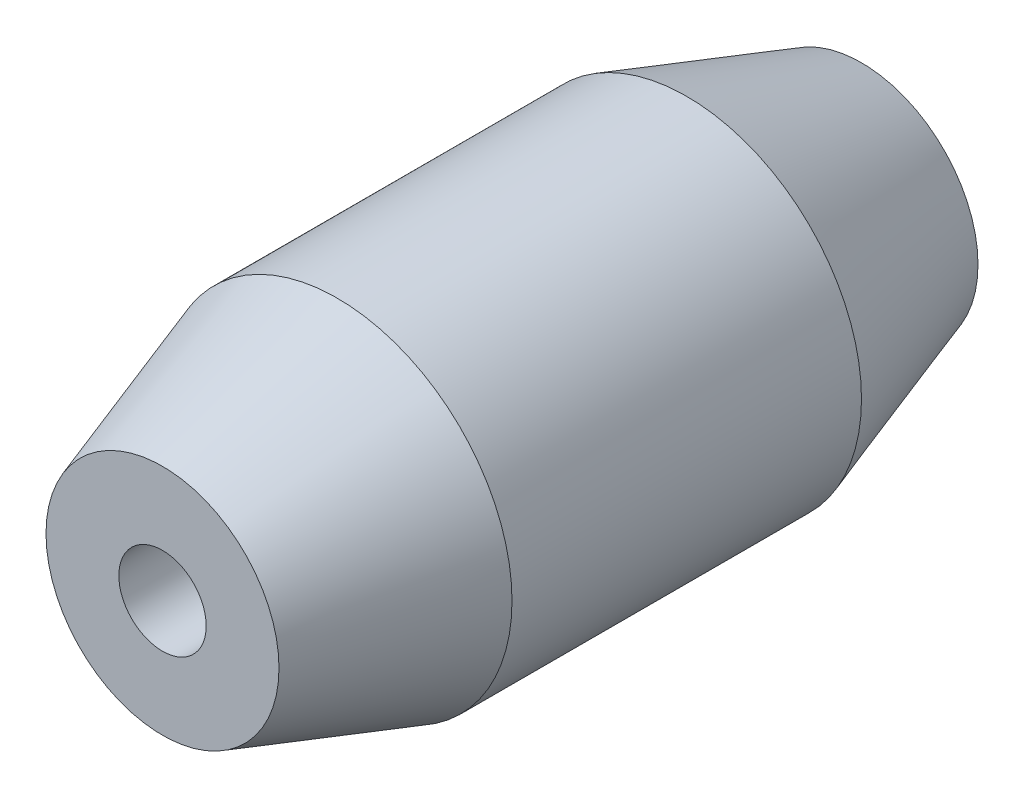
ISO-10303-21;
HEADER;
FILE_DESCRIPTION(('STEP AP214'),'2;1');
FILE_NAME('part.step','',(''),(''),'','','');
FILE_SCHEMA(('AUTOMOTIVE_DESIGN { 1 0 10303 214 1 1 1 1 }'));
ENDSEC;
DATA;
#1=APPLICATION_CONTEXT('core data for automotive mechanical design processes');
#2=APPLICATION_PROTOCOL_DEFINITION('international standard','automotive_design',2000,#1);
#3=PRODUCT_CONTEXT('',#1,'mechanical');
#4=PRODUCT('Part','Part','',(#3));
#5=PRODUCT_RELATED_PRODUCT_CATEGORY('part','',(#4));
#6=PRODUCT_DEFINITION_FORMATION('','',#4);
#7=PRODUCT_DEFINITION_CONTEXT('part definition',#1,'design');
#8=PRODUCT_DEFINITION('design','',#6,#7);
#9=PRODUCT_DEFINITION_SHAPE('','',#8);
#10=(LENGTH_UNIT() NAMED_UNIT(*) SI_UNIT(.MILLI.,.METRE.));
#11=(NAMED_UNIT(*) PLANE_ANGLE_UNIT() SI_UNIT($,.RADIAN.));
#12=(NAMED_UNIT(*) SI_UNIT($,.STERADIAN.) SOLID_ANGLE_UNIT());
#13=UNCERTAINTY_MEASURE_WITH_UNIT(LENGTH_MEASURE(1.E-05),#10,'distance_accuracy_value','');
#14=(GEOMETRIC_REPRESENTATION_CONTEXT(3) GLOBAL_UNCERTAINTY_ASSIGNED_CONTEXT((#13)) GLOBAL_UNIT_ASSIGNED_CONTEXT((#10,
#11,#12)) REPRESENTATION_CONTEXT('',''));
#15=CARTESIAN_POINT('',(0.,0.,0.));
#16=DIRECTION('',(0.,0.,1.));
#17=DIRECTION('',(1.,0.,0.));
#18=AXIS2_PLACEMENT_3D('',#15,#16,#17);
#19=CARTESIAN_POINT('',(0.,0.,12.));
#20=DIRECTION('',(0.,0.,1.));
#21=DIRECTION('',(1.,0.,0.));
#22=AXIS2_PLACEMENT_3D('',#19,#20,#21);
#23=PLANE('',#22);
#24=CARTESIAN_POINT('',(0.,0.,12.));
#25=DIRECTION('',(0.,0.,1.));
#26=DIRECTION('',(1.,0.,0.));
#27=AXIS2_PLACEMENT_3D('',#24,#25,#26);
#28=CIRCLE('',#27,2.);
#29=CARTESIAN_POINT('',(2.,0.,12.));
#30=VERTEX_POINT('',#29);
#31=EDGE_CURVE('E46',#30,#30,#28,.T.);
#32=ORIENTED_EDGE('',*,*,#31,.T.);
#33=EDGE_LOOP('',(#32));
#34=FACE_BOUND('',#33,.T.);
#35=CARTESIAN_POINT('',(0.,0.,12.));
#36=DIRECTION('',(0.,0.,1.));
#37=DIRECTION('',(1.,0.,0.));
#38=AXIS2_PLACEMENT_3D('',#35,#36,#37);
#39=CIRCLE('',#38,0.75);
#40=CARTESIAN_POINT('',(0.75,0.,12.));
#41=VERTEX_POINT('',#40);
#42=EDGE_CURVE('E51',#41,#41,#39,.T.);
#43=ORIENTED_EDGE('',*,*,#42,.F.);
#44=EDGE_LOOP('',(#43));
#45=FACE_BOUND('',#44,.T.);
#46=ADVANCED_FACE('F31',(#34,#45),#23,.T.);
#47=CARTESIAN_POINT('',(0.,0.,0.));
#48=DIRECTION('',(0.,0.,1.));
#49=DIRECTION('',(1.,0.,0.));
#50=AXIS2_PLACEMENT_3D('',#47,#48,#49);
#51=PLANE('',#50);
#52=CARTESIAN_POINT('',(0.,0.,0.));
#53=DIRECTION('',(0.,0.,1.));
#54=DIRECTION('',(1.,0.,0.));
#55=AXIS2_PLACEMENT_3D('',#52,#53,#54);
#56=CIRCLE('',#55,2.);
#57=CARTESIAN_POINT('',(2.,0.,0.));
#58=VERTEX_POINT('',#57);
#59=EDGE_CURVE('E10',#58,#58,#56,.F.);
#60=ORIENTED_EDGE('',*,*,#59,.T.);
#61=EDGE_LOOP('',(#60));
#62=FACE_BOUND('',#61,.T.);
#63=CARTESIAN_POINT('',(0.,0.,0.));
#64=DIRECTION('',(0.,0.,1.));
#65=DIRECTION('',(1.,0.,0.));
#66=AXIS2_PLACEMENT_3D('',#63,#64,#65);
#67=CIRCLE('',#66,0.75);
#68=CARTESIAN_POINT('',(0.75,0.,0.));
#69=VERTEX_POINT('',#68);
#70=EDGE_CURVE('E52',#69,#69,#67,.T.);
#71=ORIENTED_EDGE('',*,*,#70,.T.);
#72=EDGE_LOOP('',(#71));
#73=FACE_BOUND('',#72,.T.);
#74=ADVANCED_FACE('F62',(#62,#73),#51,.F.);
#75=CARTESIAN_POINT('',(0.,0.,12.));
#76=DIRECTION('',(0.,0.,-1.));
#77=DIRECTION('',(-1.,0.,0.));
#78=AXIS2_PLACEMENT_3D('',#75,#76,#77);
#79=CYLINDRICAL_SURFACE('',#78,3.);
#80=CARTESIAN_POINT('',(0.,0.,3.00000000000003));
#81=DIRECTION('',(0.,0.,1.));
#82=DIRECTION('',(1.,0.,0.));
#83=AXIS2_PLACEMENT_3D('',#80,#81,#82);
#84=CIRCLE('',#83,3.);
#85=CARTESIAN_POINT('',(3.,0.,3.00000000000003));
#86=VERTEX_POINT('',#85);
#87=EDGE_CURVE('E38',#86,#86,#84,.T.);
#88=ORIENTED_EDGE('',*,*,#87,.T.);
#89=EDGE_LOOP('',(#88));
#90=FACE_BOUND('',#89,.T.);
#91=CARTESIAN_POINT('',(0.,0.,8.99999999999997));
#92=DIRECTION('',(0.,0.,1.));
#93=DIRECTION('',(1.,0.,0.));
#94=AXIS2_PLACEMENT_3D('',#91,#92,#93);
#95=CIRCLE('',#94,3.);
#96=CARTESIAN_POINT('',(3.,0.,8.99999999999997));
#97=VERTEX_POINT('',#96);
#98=EDGE_CURVE('E42',#97,#97,#95,.F.);
#99=ORIENTED_EDGE('',*,*,#98,.T.);
#100=EDGE_LOOP('',(#99));
#101=FACE_BOUND('',#100,.T.);
#102=ADVANCED_FACE('F68',(#90,#101),#79,.T.);
#103=CARTESIAN_POINT('',(0.,0.,12.));
#104=DIRECTION('',(0.,0.,-1.));
#105=DIRECTION('',(-1.,0.,0.));
#106=AXIS2_PLACEMENT_3D('',#103,#104,#105);
#107=CYLINDRICAL_SURFACE('',#106,0.75);
#108=ORIENTED_EDGE('',*,*,#42,.T.);
#109=EDGE_LOOP('',(#108));
#110=FACE_BOUND('',#109,.T.);
#111=ORIENTED_EDGE('',*,*,#70,.F.);
#112=EDGE_LOOP('',(#111));
#113=FACE_BOUND('',#112,.T.);
#114=ADVANCED_FACE('F58',(#110,#113),#107,.F.);
#115=CARTESIAN_POINT('',(0.,0.,12.));
#116=DIRECTION('',(0.,0.,-1.));
#117=DIRECTION('',(-1.,0.,0.));
#118=AXIS2_PLACEMENT_3D('',#115,#116,#117);
#119=CONICAL_SURFACE('',#118,2.,0.32175055439664);
#120=ORIENTED_EDGE('',*,*,#98,.F.);
#121=EDGE_LOOP('',(#120));
#122=FACE_BOUND('',#121,.T.);
#123=ORIENTED_EDGE('',*,*,#31,.F.);
#124=EDGE_LOOP('',(#123));
#125=FACE_BOUND('',#124,.T.);
#126=ADVANCED_FACE('F73',(#122,#125),#119,.T.);
#127=CARTESIAN_POINT('',(0.,0.,3.00000000000003));
#128=DIRECTION('',(0.,0.,1.));
#129=DIRECTION('',(1.,0.,0.));
#130=AXIS2_PLACEMENT_3D('',#127,#128,#129);
#131=CONICAL_SURFACE('',#130,3.,0.321750554396639);
#132=ORIENTED_EDGE('',*,*,#59,.F.);
#133=EDGE_LOOP('',(#132));
#134=FACE_BOUND('',#133,.T.);
#135=ORIENTED_EDGE('',*,*,#87,.F.);
#136=EDGE_LOOP('',(#135));
#137=FACE_BOUND('',#136,.T.);
#138=ADVANCED_FACE('F33',(#134,#137),#131,.T.);
#139=CLOSED_SHELL('',(#46,#74,#102,#114,#126,#138));
#140=MANIFOLD_SOLID_BREP('B2',#139);
#141=ADVANCED_BREP_SHAPE_REPRESENTATION('',(#18,#140),#14);
#142=SHAPE_DEFINITION_REPRESENTATION(#9,#141);
ENDSEC;
END-ISO-10303-21;
